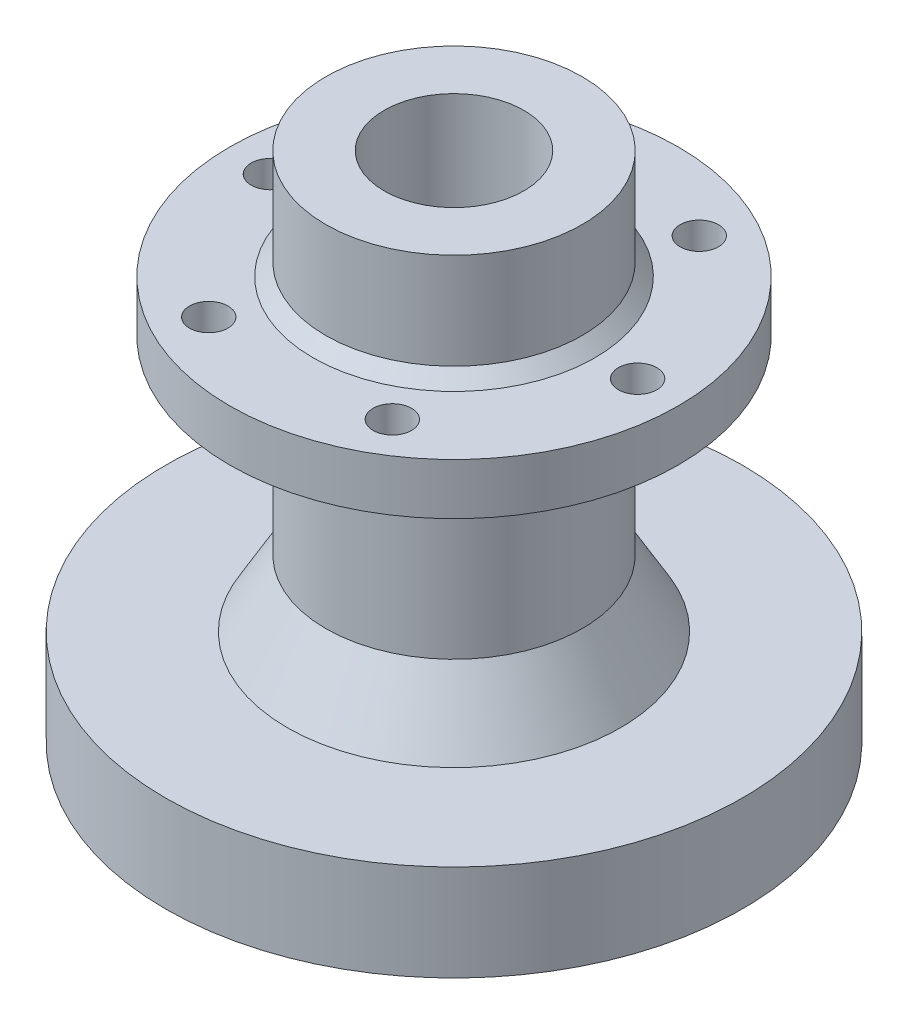
ISO-10303-21;
HEADER;
FILE_DESCRIPTION(('STEP AP214'),'2;1');
FILE_NAME('part.step','',(''),(''),'','','');
FILE_SCHEMA(('AUTOMOTIVE_DESIGN { 1 0 10303 214 1 1 1 1 }'));
ENDSEC;
DATA;
#1=APPLICATION_CONTEXT('core data for automotive mechanical design processes');
#2=APPLICATION_PROTOCOL_DEFINITION('international standard','automotive_design',2000,#1);
#3=PRODUCT_CONTEXT('',#1,'mechanical');
#4=PRODUCT('Part','Part','',(#3));
#5=PRODUCT_RELATED_PRODUCT_CATEGORY('part','',(#4));
#6=PRODUCT_DEFINITION_FORMATION('','',#4);
#7=PRODUCT_DEFINITION_CONTEXT('part definition',#1,'design');
#8=PRODUCT_DEFINITION('design','',#6,#7);
#9=PRODUCT_DEFINITION_SHAPE('','',#8);
#10=(LENGTH_UNIT() NAMED_UNIT(*) SI_UNIT(.MILLI.,.METRE.));
#11=(NAMED_UNIT(*) PLANE_ANGLE_UNIT() SI_UNIT($,.RADIAN.));
#12=(NAMED_UNIT(*) SI_UNIT($,.STERADIAN.) SOLID_ANGLE_UNIT());
#13=UNCERTAINTY_MEASURE_WITH_UNIT(LENGTH_MEASURE(1.E-05),#10,'distance_accuracy_value','');
#14=(GEOMETRIC_REPRESENTATION_CONTEXT(3) GLOBAL_UNCERTAINTY_ASSIGNED_CONTEXT((#13)) GLOBAL_UNIT_ASSIGNED_CONTEXT((#10,
#11,#12)) REPRESENTATION_CONTEXT('',''));
#15=CARTESIAN_POINT('',(0.,0.,0.));
#16=DIRECTION('',(0.,0.,1.));
#17=DIRECTION('',(1.,0.,0.));
#18=AXIS2_PLACEMENT_3D('',#15,#16,#17);
#19=CARTESIAN_POINT('',(0.,15.,0.));
#20=DIRECTION('',(0.,1.,0.));
#21=DIRECTION('',(0.,0.,1.));
#22=AXIS2_PLACEMENT_3D('',#19,#20,#21);
#23=PLANE('',#22);
#24=CARTESIAN_POINT('',(0.,15.,0.));
#25=DIRECTION('',(0.,-1.,0.));
#26=DIRECTION('',(0.,0.,-1.));
#27=AXIS2_PLACEMENT_3D('',#24,#25,#26);
#28=CIRCLE('',#27,7.00000000000001);
#29=CARTESIAN_POINT('',(2.5,15.,6.53834841531102));
#30=VERTEX_POINT('',#29);
#31=CARTESIAN_POINT('',(-2.,15.,6.70820393249938));
#32=VERTEX_POINT('',#31);
#33=EDGE_CURVE('E78',#30,#32,#28,.T.);
#34=ORIENTED_EDGE('',*,*,#33,.F.);
#35=DIRECTION('',(0.,0.,-1.));
#36=VECTOR('',#35,1.);
#37=CARTESIAN_POINT('',(2.5,15.,8.85000000000001));
#38=LINE('',#37,#36);
#39=CARTESIAN_POINT('',(2.5,15.,8.85000000000001));
#40=VERTEX_POINT('',#39);
#41=EDGE_CURVE('E80',#40,#30,#38,.T.);
#42=ORIENTED_EDGE('',*,*,#41,.F.);
#43=DIRECTION('',(1.,0.,0.));
#44=VECTOR('',#43,1.);
#45=CARTESIAN_POINT('',(-2.,15.,8.85000000000001));
#46=LINE('',#45,#44);
#47=CARTESIAN_POINT('',(-2.,15.,8.85000000000001));
#48=VERTEX_POINT('',#47);
#49=EDGE_CURVE('E91',#48,#40,#46,.T.);
#50=ORIENTED_EDGE('',*,*,#49,.F.);
#51=DIRECTION('',(0.,0.,1.));
#52=VECTOR('',#51,1.);
#53=CARTESIAN_POINT('',(-2.,15.,6.70820393249938));
#54=LINE('',#53,#52);
#55=EDGE_CURVE('E82',#32,#48,#54,.T.);
#56=ORIENTED_EDGE('',*,*,#55,.F.);
#57=EDGE_LOOP('',(#34,#42,#50,#56));
#58=FACE_BOUND('',#57,.T.);
#59=ADVANCED_FACE('F32',(#58),#23,.F.);
#60=CARTESIAN_POINT('',(0.,80.,0.));
#61=DIRECTION('',(0.,-1.,0.));
#62=DIRECTION('',(0.,0.,-1.));
#63=AXIS2_PLACEMENT_3D('',#60,#61,#62);
#64=CYLINDRICAL_SURFACE('',#63,20.);
#65=CARTESIAN_POINT('',(0.,65.,0.));
#66=DIRECTION('',(0.,1.,0.));
#67=DIRECTION('',(0.,0.,1.));
#68=AXIS2_PLACEMENT_3D('',#65,#66,#67);
#69=CIRCLE('',#68,20.);
#70=CARTESIAN_POINT('',(0.,65.,20.));
#71=VERTEX_POINT('',#70);
#72=EDGE_CURVE('E150',#71,#71,#69,.T.);
#73=ORIENTED_EDGE('',*,*,#72,.T.);
#74=EDGE_LOOP('',(#73));
#75=FACE_BOUND('',#74,.T.);
#76=CARTESIAN_POINT('',(0.,80.,0.));
#77=DIRECTION('',(0.,1.,0.));
#78=DIRECTION('',(0.,0.,1.));
#79=AXIS2_PLACEMENT_3D('',#76,#77,#78);
#80=CIRCLE('',#79,20.);
#81=CARTESIAN_POINT('',(0.,80.,20.));
#82=VERTEX_POINT('',#81);
#83=EDGE_CURVE('E124',#82,#82,#80,.T.);
#84=ORIENTED_EDGE('',*,*,#83,.F.);
#85=EDGE_LOOP('',(#84));
#86=FACE_BOUND('',#85,.T.);
#87=ADVANCED_FACE('F176',(#75,#86),#64,.T.);
#88=CARTESIAN_POINT('',(0.,80.,0.));
#89=DIRECTION('',(0.,1.,0.));
#90=DIRECTION('',(0.,0.,1.));
#91=AXIS2_PLACEMENT_3D('',#88,#89,#90);
#92=PLANE('',#91);
#93=CARTESIAN_POINT('',(0.,80.,0.));
#94=DIRECTION('',(0.,1.,0.));
#95=DIRECTION('',(0.,0.,1.));
#96=AXIS2_PLACEMENT_3D('',#93,#94,#95);
#97=CIRCLE('',#96,10.9);
#98=CARTESIAN_POINT('',(0.,80.,10.9));
#99=VERTEX_POINT('',#98);
#100=EDGE_CURVE('E117',#99,#99,#97,.T.);
#101=ORIENTED_EDGE('',*,*,#100,.F.);
#102=EDGE_LOOP('',(#101));
#103=FACE_BOUND('',#102,.T.);
#104=ORIENTED_EDGE('',*,*,#83,.T.);
#105=EDGE_LOOP('',(#104));
#106=FACE_BOUND('',#105,.T.);
#107=ADVANCED_FACE('F181',(#103,#106),#92,.T.);
#108=CARTESIAN_POINT('',(0.,28.,0.));
#109=DIRECTION('',(0.,1.,0.));
#110=DIRECTION('',(0.,0.,1.));
#111=AXIS2_PLACEMENT_3D('',#108,#109,#110);
#112=CYLINDRICAL_SURFACE('',#111,10.9);
#113=CARTESIAN_POINT('',(0.,28.,0.));
#114=DIRECTION('',(0.,1.,0.));
#115=DIRECTION('',(0.,0.,1.));
#116=AXIS2_PLACEMENT_3D('',#113,#114,#115);
#117=CIRCLE('',#116,10.9);
#118=CARTESIAN_POINT('',(0.,28.,10.9));
#119=VERTEX_POINT('',#118);
#120=EDGE_CURVE('E121',#119,#119,#117,.T.);
#121=CARTESIAN_POINT('',(0.,80.,10.9));
#122=CARTESIAN_POINT('',(0.,79.4583333333333,10.9));
#123=CARTESIAN_POINT('',(0.,78.9166666666667,10.9));
#124=CARTESIAN_POINT('',(0.,77.8333333333333,10.9));
#125=CARTESIAN_POINT('',(0.,77.2916666666667,10.9));
#126=CARTESIAN_POINT('',(0.,76.2083333333333,10.9));
#127=CARTESIAN_POINT('',(0.,75.6666666666667,10.9));
#128=CARTESIAN_POINT('',(0.,74.5833333333333,10.9));
#129=CARTESIAN_POINT('',(0.,74.0416666666667,10.9));
#130=CARTESIAN_POINT('',(0.,72.9583333333333,10.9));
#131=CARTESIAN_POINT('',(0.,72.4166666666667,10.9));
#132=CARTESIAN_POINT('',(0.,71.3333333333333,10.9));
#133=CARTESIAN_POINT('',(0.,70.7916666666667,10.9));
#134=CARTESIAN_POINT('',(0.,69.7083333333333,10.9));
#135=CARTESIAN_POINT('',(0.,69.1666666666667,10.9));
#136=CARTESIAN_POINT('',(0.,68.0833333333333,10.9));
#137=CARTESIAN_POINT('',(0.,67.5416666666667,10.9));
#138=CARTESIAN_POINT('',(0.,66.4583333333333,10.9));
#139=CARTESIAN_POINT('',(0.,65.9166666666667,10.9));
#140=CARTESIAN_POINT('',(0.,64.8333333333333,10.9));
#141=CARTESIAN_POINT('',(0.,64.2916666666667,10.9));
#142=CARTESIAN_POINT('',(0.,63.2083333333333,10.9));
#143=CARTESIAN_POINT('',(0.,62.6666666666667,10.9));
#144=CARTESIAN_POINT('',(0.,61.5833333333333,10.9));
#145=CARTESIAN_POINT('',(0.,61.0416666666667,10.9));
#146=CARTESIAN_POINT('',(0.,59.9583333333333,10.9));
#147=CARTESIAN_POINT('',(0.,59.4166666666667,10.9));
#148=CARTESIAN_POINT('',(0.,58.3333333333333,10.9));
#149=CARTESIAN_POINT('',(0.,57.7916666666667,10.9));
#150=CARTESIAN_POINT('',(0.,56.7083333333333,10.9));
#151=CARTESIAN_POINT('',(0.,56.1666666666667,10.9));
#152=CARTESIAN_POINT('',(0.,55.0833333333333,10.9));
#153=CARTESIAN_POINT('',(0.,54.5416666666667,10.9));
#154=CARTESIAN_POINT('',(0.,53.4583333333333,10.9));
#155=CARTESIAN_POINT('',(0.,52.9166666666667,10.9));
#156=CARTESIAN_POINT('',(0.,51.8333333333333,10.9));
#157=CARTESIAN_POINT('',(0.,51.2916666666667,10.9));
#158=CARTESIAN_POINT('',(0.,50.2083333333333,10.9));
#159=CARTESIAN_POINT('',(0.,49.6666666666667,10.9));
#160=CARTESIAN_POINT('',(0.,48.5833333333333,10.9));
#161=CARTESIAN_POINT('',(0.,48.0416666666667,10.9));
#162=CARTESIAN_POINT('',(0.,46.9583333333333,10.9));
#163=CARTESIAN_POINT('',(0.,46.4166666666667,10.9));
#164=CARTESIAN_POINT('',(0.,45.3333333333333,10.9));
#165=CARTESIAN_POINT('',(0.,44.7916666666667,10.9));
#166=CARTESIAN_POINT('',(0.,43.7083333333333,10.9));
#167=CARTESIAN_POINT('',(0.,43.1666666666667,10.9));
#168=CARTESIAN_POINT('',(0.,42.0833333333333,10.9));
#169=CARTESIAN_POINT('',(0.,41.5416666666667,10.9));
#170=CARTESIAN_POINT('',(0.,40.4583333333333,10.9));
#171=CARTESIAN_POINT('',(0.,39.9166666666667,10.9));
#172=CARTESIAN_POINT('',(0.,38.8333333333333,10.9));
#173=CARTESIAN_POINT('',(0.,38.2916666666667,10.9));
#174=CARTESIAN_POINT('',(0.,37.2083333333333,10.9));
#175=CARTESIAN_POINT('',(0.,36.6666666666667,10.9));
#176=CARTESIAN_POINT('',(0.,35.5833333333333,10.9));
#177=CARTESIAN_POINT('',(0.,35.0416666666667,10.9));
#178=CARTESIAN_POINT('',(0.,33.9583333333333,10.9));
#179=CARTESIAN_POINT('',(0.,33.4166666666667,10.9));
#180=CARTESIAN_POINT('',(0.,32.3333333333333,10.9));
#181=CARTESIAN_POINT('',(0.,31.7916666666667,10.9));
#182=CARTESIAN_POINT('',(0.,30.7083333333333,10.9));
#183=CARTESIAN_POINT('',(0.,30.1666666666667,10.9));
#184=CARTESIAN_POINT('',(0.,29.0833333333333,10.9));
#185=CARTESIAN_POINT('',(0.,28.5416666666667,10.9));
#186=CARTESIAN_POINT('',(0.,28.,10.9));
#187=B_SPLINE_CURVE_WITH_KNOTS('',3,(#121,#122,#123,#124,#125,#126,#127,#128,#129,#130,#131,
#132,#133,#134,#135,#136,#137,#138,#139,#140,#141,#142,#143,#144,#145,#146,#147,#148,#149,#150,
#151,#152,#153,#154,#155,#156,#157,#158,#159,#160,#161,#162,#163,#164,#165,#166,#167,#168,#169,
#170,#171,#172,#173,#174,#175,#176,#177,#178,#179,#180,#181,#182,#183,#184,#185,#186),
.UNSPECIFIED.,.F.,.F.,(4,2,2,2,2,2,2,2,2,2,2,2,2,2,2,2,2,2,2,2,2,2,2,2,2,2,2,2,2,2,2,2,4),(0.,
1.625,3.25,4.875,6.49999999999999,8.12500000000001,9.74999999999999,11.375,13.,14.625,16.25,
17.875,19.5,21.125,22.75,24.375,26.,27.625,29.25,30.875,32.5,34.125,35.75,37.375,39.,40.625,
42.25,43.875,45.5,47.125,48.75,50.375,52.),.UNSPECIFIED.);
#188=EDGE_CURVE('BSEAM238',#99,#119,#187,.T.);
#189=ORIENTED_EDGE('',*,*,#100,.T.);
#190=ORIENTED_EDGE('',*,*,#120,.F.);
#191=ORIENTED_EDGE('',*,*,#188,.T.);
#192=ORIENTED_EDGE('',*,*,#188,.F.);
#193=EDGE_LOOP('',(#189,#191,#190,#192));
#194=FACE_BOUND('',#193,.T.);
#195=ADVANCED_FACE('F238',(#194),#112,.F.);
#196=CARTESIAN_POINT('',(0.,28.,0.));
#197=DIRECTION('',(0.,1.,0.));
#198=DIRECTION('',(0.,0.,1.));
#199=AXIS2_PLACEMENT_3D('',#196,#197,#198);
#200=PLANE('',#199);
#201=ORIENTED_EDGE('',*,*,#120,.T.);
#202=EDGE_LOOP('',(#201));
#203=FACE_BOUND('',#202,.T.);
#204=ADVANCED_FACE('F236',(#203),#200,.T.);
#205=CARTESIAN_POINT('',(0.,63.,0.));
#206=DIRECTION('',(0.,1.,0.));
#207=DIRECTION('',(0.,0.,1.));
#208=AXIS2_PLACEMENT_3D('',#205,#206,#207);
#209=PLANE('',#208);
#210=CARTESIAN_POINT('',(-13.6441470029597,63.,24.6321726778465));
#211=DIRECTION('',(0.,1.,0.));
#212=DIRECTION('',(0.,0.,1.));
#213=AXIS2_PLACEMENT_3D('',#210,#211,#212);
#214=CIRCLE('',#213,3.);
#215=CARTESIAN_POINT('',(-13.6441470029597,63.,27.6321726778465));
#216=VERTEX_POINT('',#215);
#217=EDGE_CURVE('E399',#216,#216,#214,.T.);
#218=ORIENTED_EDGE('',*,*,#217,.F.);
#219=EDGE_LOOP('',(#218));
#220=FACE_BOUND('',#219,.T.);
#221=CARTESIAN_POINT('',(14.5100137879402,63.,24.1322642564556));
#222=DIRECTION('',(0.,1.,0.));
#223=DIRECTION('',(0.,0.,1.));
#224=AXIS2_PLACEMENT_3D('',#221,#222,#223);
#225=CIRCLE('',#224,3.);
#226=CARTESIAN_POINT('',(14.5100137879402,63.,27.1322642564556));
#227=VERTEX_POINT('',#226);
#228=EDGE_CURVE('E403',#227,#227,#225,.T.);
#229=ORIENTED_EDGE('',*,*,#228,.F.);
#230=EDGE_LOOP('',(#229));
#231=FACE_BOUND('',#230,.T.);
#232=CARTESIAN_POINT('',(28.1541607908998,63.,-0.499908421390969));
#233=DIRECTION('',(0.,1.,0.));
#234=DIRECTION('',(0.,0.,1.));
#235=AXIS2_PLACEMENT_3D('',#232,#233,#234);
#236=CIRCLE('',#235,3.);
#237=CARTESIAN_POINT('',(28.1541607908998,63.,2.50009157860903));
#238=VERTEX_POINT('',#237);
#239=EDGE_CURVE('E411',#238,#238,#236,.T.);
#240=ORIENTED_EDGE('',*,*,#239,.F.);
#241=EDGE_LOOP('',(#240));
#242=FACE_BOUND('',#241,.T.);
#243=CARTESIAN_POINT('',(13.6441470029595,63.,-24.6321726778466));
#244=DIRECTION('',(0.,1.,0.));
#245=DIRECTION('',(0.,0.,1.));
#246=AXIS2_PLACEMENT_3D('',#243,#244,#245);
#247=CIRCLE('',#246,3.00000000000001);
#248=CARTESIAN_POINT('',(13.6441470029595,63.,-21.6321726778466));
#249=VERTEX_POINT('',#248);
#250=EDGE_CURVE('E416',#249,#249,#247,.T.);
#251=ORIENTED_EDGE('',*,*,#250,.F.);
#252=EDGE_LOOP('',(#251));
#253=FACE_BOUND('',#252,.T.);
#254=CARTESIAN_POINT('',(-14.5100137879404,63.,-24.1322642564555));
#255=DIRECTION('',(0.,1.,0.));
#256=DIRECTION('',(0.,0.,1.));
#257=AXIS2_PLACEMENT_3D('',#254,#255,#256);
#258=CIRCLE('',#257,3.);
#259=CARTESIAN_POINT('',(-14.5100137879404,63.,-21.1322642564555));
#260=VERTEX_POINT('',#259);
#261=EDGE_CURVE('E422',#260,#260,#258,.T.);
#262=ORIENTED_EDGE('',*,*,#261,.F.);
#263=EDGE_LOOP('',(#262));
#264=FACE_BOUND('',#263,.T.);
#265=CARTESIAN_POINT('',(-28.1541607908998,63.,0.499908421391165));
#266=DIRECTION('',(0.,1.,0.));
#267=DIRECTION('',(0.,0.,1.));
#268=AXIS2_PLACEMENT_3D('',#265,#266,#267);
#269=CIRCLE('',#268,3.);
#270=CARTESIAN_POINT('',(-28.1541607908998,63.,3.49990842139117));
#271=VERTEX_POINT('',#270);
#272=EDGE_CURVE('E428',#271,#271,#269,.T.);
#273=ORIENTED_EDGE('',*,*,#272,.F.);
#274=EDGE_LOOP('',(#273));
#275=FACE_BOUND('',#274,.T.);
#276=CARTESIAN_POINT('',(0.,63.,0.));
#277=DIRECTION('',(0.,1.,0.));
#278=DIRECTION('',(0.,0.,1.));
#279=AXIS2_PLACEMENT_3D('',#276,#277,#278);
#280=CIRCLE('',#279,22.);
#281=CARTESIAN_POINT('',(0.,63.,22.));
#282=VERTEX_POINT('',#281);
#283=EDGE_CURVE('E153',#282,#282,#280,.F.);
#284=ORIENTED_EDGE('',*,*,#283,.T.);
#285=EDGE_LOOP('',(#284));
#286=FACE_BOUND('',#285,.T.);
#287=CARTESIAN_POINT('',(0.,63.,0.));
#288=DIRECTION('',(0.,1.,0.));
#289=DIRECTION('',(0.,0.,1.));
#290=AXIS2_PLACEMENT_3D('',#287,#288,#289);
#291=CIRCLE('',#290,35.);
#292=CARTESIAN_POINT('',(0.,63.,35.));
#293=VERTEX_POINT('',#292);
#294=EDGE_CURVE('E114',#293,#293,#291,.T.);
#295=ORIENTED_EDGE('',*,*,#294,.T.);
#296=EDGE_LOOP('',(#295));
#297=FACE_BOUND('',#296,.T.);
#298=ADVANCED_FACE('F223',(#220,#231,#242,#253,#264,#275,#286,#297),#209,.T.);
#299=CARTESIAN_POINT('',(0.,55.,0.));
#300=DIRECTION('',(0.,1.,0.));
#301=DIRECTION('',(0.,0.,1.));
#302=AXIS2_PLACEMENT_3D('',#299,#300,#301);
#303=PLANE('',#302);
#304=CARTESIAN_POINT('',(-13.6441470029597,55.,24.6321726778465));
#305=DIRECTION('',(0.,1.,0.));
#306=DIRECTION('',(0.,0.,1.));
#307=AXIS2_PLACEMENT_3D('',#304,#305,#306);
#308=CIRCLE('',#307,3.);
#309=CARTESIAN_POINT('',(-13.6441470029597,55.,27.6321726778465));
#310=VERTEX_POINT('',#309);
#311=EDGE_CURVE('E402',#310,#310,#308,.F.);
#312=ORIENTED_EDGE('',*,*,#311,.F.);
#313=EDGE_LOOP('',(#312));
#314=FACE_BOUND('',#313,.T.);
#315=CARTESIAN_POINT('',(14.5100137879402,55.,24.1322642564556));
#316=DIRECTION('',(0.,1.,0.));
#317=DIRECTION('',(0.,0.,1.));
#318=AXIS2_PLACEMENT_3D('',#315,#316,#317);
#319=CIRCLE('',#318,3.);
#320=CARTESIAN_POINT('',(14.5100137879402,55.,27.1322642564556));
#321=VERTEX_POINT('',#320);
#322=EDGE_CURVE('E406',#321,#321,#319,.F.);
#323=ORIENTED_EDGE('',*,*,#322,.F.);
#324=EDGE_LOOP('',(#323));
#325=FACE_BOUND('',#324,.T.);
#326=CARTESIAN_POINT('',(28.1541607908998,55.,-0.499908421390969));
#327=DIRECTION('',(0.,1.,0.));
#328=DIRECTION('',(0.,0.,1.));
#329=AXIS2_PLACEMENT_3D('',#326,#327,#328);
#330=CIRCLE('',#329,3.);
#331=CARTESIAN_POINT('',(28.1541607908998,55.,2.50009157860903));
#332=VERTEX_POINT('',#331);
#333=EDGE_CURVE('E413',#332,#332,#330,.F.);
#334=ORIENTED_EDGE('',*,*,#333,.F.);
#335=EDGE_LOOP('',(#334));
#336=FACE_BOUND('',#335,.T.);
#337=CARTESIAN_POINT('',(13.6441470029595,55.,-24.6321726778466));
#338=DIRECTION('',(0.,1.,0.));
#339=DIRECTION('',(0.,0.,1.));
#340=AXIS2_PLACEMENT_3D('',#337,#338,#339);
#341=CIRCLE('',#340,3.00000000000001);
#342=CARTESIAN_POINT('',(13.6441470029595,55.,-21.6321726778466));
#343=VERTEX_POINT('',#342);
#344=EDGE_CURVE('E419',#343,#343,#341,.F.);
#345=ORIENTED_EDGE('',*,*,#344,.F.);
#346=EDGE_LOOP('',(#345));
#347=FACE_BOUND('',#346,.T.);
#348=CARTESIAN_POINT('',(-14.5100137879404,55.,-24.1322642564555));
#349=DIRECTION('',(0.,1.,0.));
#350=DIRECTION('',(0.,0.,1.));
#351=AXIS2_PLACEMENT_3D('',#348,#349,#350);
#352=CIRCLE('',#351,3.);
#353=CARTESIAN_POINT('',(-14.5100137879404,55.,-21.1322642564555));
#354=VERTEX_POINT('',#353);
#355=EDGE_CURVE('E425',#354,#354,#352,.F.);
#356=ORIENTED_EDGE('',*,*,#355,.F.);
#357=EDGE_LOOP('',(#356));
#358=FACE_BOUND('',#357,.T.);
#359=CARTESIAN_POINT('',(-28.1541607908998,55.,0.499908421391165));
#360=DIRECTION('',(0.,1.,0.));
#361=DIRECTION('',(0.,0.,1.));
#362=AXIS2_PLACEMENT_3D('',#359,#360,#361);
#363=CIRCLE('',#362,3.);
#364=CARTESIAN_POINT('',(-28.1541607908998,55.,3.49990842139117));
#365=VERTEX_POINT('',#364);
#366=EDGE_CURVE('E85',#365,#365,#363,.F.);
#367=ORIENTED_EDGE('',*,*,#366,.F.);
#368=EDGE_LOOP('',(#367));
#369=FACE_BOUND('',#368,.T.);
#370=CARTESIAN_POINT('',(0.,55.,0.));
#371=DIRECTION('',(0.,1.,0.));
#372=DIRECTION('',(0.,0.,1.));
#373=AXIS2_PLACEMENT_3D('',#370,#371,#372);
#374=CIRCLE('',#373,22.);
#375=CARTESIAN_POINT('',(0.,55.,22.));
#376=VERTEX_POINT('',#375);
#377=EDGE_CURVE('E142',#376,#376,#374,.T.);
#378=ORIENTED_EDGE('',*,*,#377,.T.);
#379=EDGE_LOOP('',(#378));
#380=FACE_BOUND('',#379,.T.);
#381=CARTESIAN_POINT('',(0.,55.,0.));
#382=DIRECTION('',(0.,1.,0.));
#383=DIRECTION('',(0.,0.,1.));
#384=AXIS2_PLACEMENT_3D('',#381,#382,#383);
#385=CIRCLE('',#384,35.);
#386=CARTESIAN_POINT('',(0.,55.,35.));
#387=VERTEX_POINT('',#386);
#388=EDGE_CURVE('E118',#387,#387,#385,.T.);
#389=ORIENTED_EDGE('',*,*,#388,.F.);
#390=EDGE_LOOP('',(#389));
#391=FACE_BOUND('',#390,.T.);
#392=ADVANCED_FACE('F220',(#314,#325,#336,#347,#358,#369,#380,#391),#303,.F.);
#393=CARTESIAN_POINT('',(0.,63.,0.));
#394=DIRECTION('',(0.,-1.,0.));
#395=DIRECTION('',(0.,0.,-1.));
#396=AXIS2_PLACEMENT_3D('',#393,#394,#395);
#397=CYLINDRICAL_SURFACE('',#396,35.);
#398=ORIENTED_EDGE('',*,*,#294,.F.);
#399=EDGE_LOOP('',(#398));
#400=FACE_BOUND('',#399,.T.);
#401=ORIENTED_EDGE('',*,*,#388,.T.);
#402=EDGE_LOOP('',(#401));
#403=FACE_BOUND('',#402,.T.);
#404=ADVANCED_FACE('F190',(#400,#403),#397,.T.);
#405=CARTESIAN_POINT('',(2.5,15.,8.85000000000001));
#406=DIRECTION('',(-1.,0.,0.));
#407=DIRECTION('',(0.,0.,1.));
#408=AXIS2_PLACEMENT_3D('',#405,#406,#407);
#409=PLANE('',#408);
#410=DIRECTION('',(0.,0.,-1.));
#411=VECTOR('',#410,1.);
#412=CARTESIAN_POINT('',(2.5,0.,8.85000000000001));
#413=LINE('',#412,#411);
#414=CARTESIAN_POINT('',(2.5,0.,8.85000000000001));
#415=VERTEX_POINT('',#414);
#416=CARTESIAN_POINT('',(2.5,0.,6.53834841531102));
#417=VERTEX_POINT('',#416);
#418=EDGE_CURVE('E108',#415,#417,#413,.T.);
#419=ORIENTED_EDGE('',*,*,#418,.F.);
#420=DIRECTION('',(0.,-1.,0.));
#421=VECTOR('',#420,1.);
#422=CARTESIAN_POINT('',(2.5,15.,8.85000000000001));
#423=LINE('',#422,#421);
#424=EDGE_CURVE('E57',#40,#415,#423,.T.);
#425=ORIENTED_EDGE('',*,*,#424,.F.);
#426=ORIENTED_EDGE('',*,*,#41,.T.);
#427=DIRECTION('',(0.,-1.,0.));
#428=VECTOR('',#427,1.);
#429=CARTESIAN_POINT('',(2.5,15.,6.53834841531102));
#430=LINE('',#429,#428);
#431=EDGE_CURVE('E89',#30,#417,#430,.T.);
#432=ORIENTED_EDGE('',*,*,#431,.T.);
#433=EDGE_LOOP('',(#419,#425,#426,#432));
#434=FACE_BOUND('',#433,.T.);
#435=ADVANCED_FACE('F88',(#434),#409,.T.);
#436=CARTESIAN_POINT('',(-2.,15.,8.85000000000001));
#437=DIRECTION('',(0.,0.,-1.));
#438=DIRECTION('',(-1.,0.,0.));
#439=AXIS2_PLACEMENT_3D('',#436,#437,#438);
#440=PLANE('',#439);
#441=DIRECTION('',(1.,0.,0.));
#442=VECTOR('',#441,1.);
#443=CARTESIAN_POINT('',(-2.,0.,8.85000000000001));
#444=LINE('',#443,#442);
#445=CARTESIAN_POINT('',(-2.,0.,8.85000000000001));
#446=VERTEX_POINT('',#445);
#447=EDGE_CURVE('E134',#446,#415,#444,.T.);
#448=ORIENTED_EDGE('',*,*,#447,.F.);
#449=DIRECTION('',(0.,-1.,0.));
#450=VECTOR('',#449,1.);
#451=CARTESIAN_POINT('',(-2.,15.,8.85000000000001));
#452=LINE('',#451,#450);
#453=EDGE_CURVE('E95',#48,#446,#452,.T.);
#454=ORIENTED_EDGE('',*,*,#453,.F.);
#455=ORIENTED_EDGE('',*,*,#49,.T.);
#456=ORIENTED_EDGE('',*,*,#424,.T.);
#457=EDGE_LOOP('',(#448,#454,#455,#456));
#458=FACE_BOUND('',#457,.T.);
#459=ADVANCED_FACE('F189',(#458),#440,.T.);
#460=CARTESIAN_POINT('',(-2.,15.,6.70820393249938));
#461=DIRECTION('',(1.,0.,0.));
#462=DIRECTION('',(0.,0.,-1.));
#463=AXIS2_PLACEMENT_3D('',#460,#461,#462);
#464=PLANE('',#463);
#465=DIRECTION('',(0.,0.,1.));
#466=VECTOR('',#465,1.);
#467=CARTESIAN_POINT('',(-2.,0.,6.70820393249938));
#468=LINE('',#467,#466);
#469=CARTESIAN_POINT('',(-2.,0.,6.70820393249938));
#470=VERTEX_POINT('',#469);
#471=EDGE_CURVE('E131',#470,#446,#468,.T.);
#472=ORIENTED_EDGE('',*,*,#471,.F.);
#473=DIRECTION('',(0.,-1.,0.));
#474=VECTOR('',#473,1.);
#475=CARTESIAN_POINT('',(-2.,15.,6.70820393249938));
#476=LINE('',#475,#474);
#477=EDGE_CURVE('E102',#32,#470,#476,.T.);
#478=ORIENTED_EDGE('',*,*,#477,.F.);
#479=ORIENTED_EDGE('',*,*,#55,.T.);
#480=ORIENTED_EDGE('',*,*,#453,.T.);
#481=EDGE_LOOP('',(#472,#478,#479,#480));
#482=FACE_BOUND('',#481,.T.);
#483=ADVANCED_FACE('F193',(#482),#464,.T.);
#484=CARTESIAN_POINT('',(0.,15.,0.));
#485=DIRECTION('',(0.,-1.,0.));
#486=DIRECTION('',(0.,0.,-1.));
#487=AXIS2_PLACEMENT_3D('',#484,#485,#486);
#488=CYLINDRICAL_SURFACE('',#487,7.00000000000001);
#489=CARTESIAN_POINT('',(0.,0.,0.));
#490=DIRECTION('',(0.,1.,0.));
#491=DIRECTION('',(0.,0.,1.));
#492=AXIS2_PLACEMENT_3D('',#489,#490,#491);
#493=CIRCLE('',#492,7.00000000000001);
#494=EDGE_CURVE('E49',#417,#470,#493,.T.);
#495=ORIENTED_EDGE('',*,*,#494,.F.);
#496=ORIENTED_EDGE('',*,*,#431,.F.);
#497=ORIENTED_EDGE('',*,*,#33,.T.);
#498=ORIENTED_EDGE('',*,*,#477,.T.);
#499=EDGE_LOOP('',(#495,#496,#497,#498));
#500=FACE_BOUND('',#499,.T.);
#501=CARTESIAN_POINT('',(0.,19.,0.));
#502=DIRECTION('',(0.,-1.,0.));
#503=DIRECTION('',(0.,0.,-1.));
#504=AXIS2_PLACEMENT_3D('',#501,#502,#503);
#505=CIRCLE('',#504,7.00000000000001);
#506=CARTESIAN_POINT('',(0.,19.,-7.00000000000001));
#507=VERTEX_POINT('',#506);
#508=EDGE_CURVE('E84',#507,#507,#505,.T.);
#509=ORIENTED_EDGE('',*,*,#508,.F.);
#510=EDGE_LOOP('',(#509));
#511=FACE_BOUND('',#510,.T.);
#512=ADVANCED_FACE('F93',(#500,#511),#488,.F.);
#513=CARTESIAN_POINT('',(0.,0.,0.));
#514=DIRECTION('',(0.,1.,0.));
#515=DIRECTION('',(0.,0.,1.));
#516=AXIS2_PLACEMENT_3D('',#513,#514,#515);
#517=PLANE('',#516);
#518=CARTESIAN_POINT('',(0.,0.,0.));
#519=DIRECTION('',(0.,1.,0.));
#520=DIRECTION('',(0.,0.,1.));
#521=AXIS2_PLACEMENT_3D('',#518,#519,#520);
#522=CIRCLE('',#521,45.);
#523=CARTESIAN_POINT('',(0.,0.,45.));
#524=VERTEX_POINT('',#523);
#525=EDGE_CURVE('E104',#524,#524,#522,.T.);
#526=ORIENTED_EDGE('',*,*,#525,.F.);
#527=EDGE_LOOP('',(#526));
#528=FACE_BOUND('',#527,.T.);
#529=ORIENTED_EDGE('',*,*,#494,.T.);
#530=ORIENTED_EDGE('',*,*,#471,.T.);
#531=ORIENTED_EDGE('',*,*,#447,.T.);
#532=ORIENTED_EDGE('',*,*,#418,.T.);
#533=EDGE_LOOP('',(#529,#530,#531,#532));
#534=FACE_BOUND('',#533,.T.);
#535=ADVANCED_FACE('F199',(#528,#534),#517,.F.);
#536=CARTESIAN_POINT('',(0.,15.,0.));
#537=DIRECTION('',(0.,-1.,0.));
#538=DIRECTION('',(0.,0.,-1.));
#539=AXIS2_PLACEMENT_3D('',#536,#537,#538);
#540=CYLINDRICAL_SURFACE('',#539,45.);
#541=CARTESIAN_POINT('',(0.,15.,0.));
#542=DIRECTION('',(0.,1.,0.));
#543=DIRECTION('',(0.,0.,1.));
#544=AXIS2_PLACEMENT_3D('',#541,#542,#543);
#545=CIRCLE('',#544,45.);
#546=CARTESIAN_POINT('',(0.,15.,45.));
#547=VERTEX_POINT('',#546);
#548=EDGE_CURVE('E139',#547,#547,#545,.T.);
#549=ORIENTED_EDGE('',*,*,#548,.F.);
#550=EDGE_LOOP('',(#549));
#551=FACE_BOUND('',#550,.T.);
#552=ORIENTED_EDGE('',*,*,#525,.T.);
#553=EDGE_LOOP('',(#552));
#554=FACE_BOUND('',#553,.T.);
#555=ADVANCED_FACE('F203',(#551,#554),#540,.T.);
#556=CARTESIAN_POINT('',(0.,15.,0.));
#557=DIRECTION('',(0.,1.,0.));
#558=DIRECTION('',(0.,0.,1.));
#559=AXIS2_PLACEMENT_3D('',#556,#557,#558);
#560=PLANE('',#559);
#561=CARTESIAN_POINT('',(0.,15.,0.));
#562=DIRECTION('',(0.,1.,0.));
#563=DIRECTION('',(0.,0.,1.));
#564=AXIS2_PLACEMENT_3D('',#561,#562,#563);
#565=CIRCLE('',#564,26.);
#566=CARTESIAN_POINT('',(0.,15.,26.));
#567=VERTEX_POINT('',#566);
#568=EDGE_CURVE('E11',#567,#567,#565,.F.);
#569=ORIENTED_EDGE('',*,*,#568,.T.);
#570=EDGE_LOOP('',(#569));
#571=FACE_BOUND('',#570,.T.);
#572=ORIENTED_EDGE('',*,*,#548,.T.);
#573=EDGE_LOOP('',(#572));
#574=FACE_BOUND('',#573,.T.);
#575=ADVANCED_FACE('F200',(#571,#574),#560,.T.);
#576=CARTESIAN_POINT('',(0.,25.3923048454134,0.));
#577=DIRECTION('',(0.,1.,0.));
#578=DIRECTION('',(0.,0.,1.));
#579=AXIS2_PLACEMENT_3D('',#576,#577,#578);
#580=CIRCLE('',#579,20.);
#581=CARTESIAN_POINT('',(0.,25.3923048454134,20.));
#582=VERTEX_POINT('',#581);
#583=EDGE_CURVE('E41',#582,#582,#580,.T.);
#584=ORIENTED_EDGE('',*,*,#583,.T.);
#585=EDGE_LOOP('',(#584));
#586=FACE_BOUND('',#585,.T.);
#587=CARTESIAN_POINT('',(0.,53.,0.));
#588=DIRECTION('',(0.,1.,0.));
#589=DIRECTION('',(0.,0.,1.));
#590=AXIS2_PLACEMENT_3D('',#587,#588,#589);
#591=CIRCLE('',#590,20.);
#592=CARTESIAN_POINT('',(0.,53.,20.));
#593=VERTEX_POINT('',#592);
#594=EDGE_CURVE('E147',#593,#593,#591,.F.);
#595=ORIENTED_EDGE('',*,*,#594,.T.);
#596=EDGE_LOOP('',(#595));
#597=FACE_BOUND('',#596,.T.);
#598=ADVANCED_FACE('F158',(#586,#597),#64,.T.);
#599=CARTESIAN_POINT('',(0.,55.,0.));
#600=DIRECTION('',(0.,1.,0.));
#601=DIRECTION('',(0.,0.,1.));
#602=AXIS2_PLACEMENT_3D('',#599,#600,#601);
#603=CONICAL_SURFACE('',#602,22.,0.785398163397451);
#604=ORIENTED_EDGE('',*,*,#594,.F.);
#605=EDGE_LOOP('',(#604));
#606=FACE_BOUND('',#605,.T.);
#607=ORIENTED_EDGE('',*,*,#377,.F.);
#608=EDGE_LOOP('',(#607));
#609=FACE_BOUND('',#608,.T.);
#610=ADVANCED_FACE('F172',(#606,#609),#603,.T.);
#611=CARTESIAN_POINT('',(0.,65.,0.));
#612=DIRECTION('',(0.,-1.,0.));
#613=DIRECTION('',(0.,0.,-1.));
#614=AXIS2_PLACEMENT_3D('',#611,#612,#613);
#615=CONICAL_SURFACE('',#614,20.,0.785398163397446);
#616=ORIENTED_EDGE('',*,*,#283,.F.);
#617=EDGE_LOOP('',(#616));
#618=FACE_BOUND('',#617,.T.);
#619=ORIENTED_EDGE('',*,*,#72,.F.);
#620=EDGE_LOOP('',(#619));
#621=FACE_BOUND('',#620,.T.);
#622=ADVANCED_FACE('F163',(#618,#621),#615,.T.);
#623=CARTESIAN_POINT('',(0.,25.3923048454134,0.));
#624=DIRECTION('',(0.,-1.,0.));
#625=DIRECTION('',(0.,0.,-1.));
#626=AXIS2_PLACEMENT_3D('',#623,#624,#625);
#627=CONICAL_SURFACE('',#626,20.,0.523598775598293);
#628=ORIENTED_EDGE('',*,*,#568,.F.);
#629=EDGE_LOOP('',(#628));
#630=FACE_BOUND('',#629,.T.);
#631=ORIENTED_EDGE('',*,*,#583,.F.);
#632=EDGE_LOOP('',(#631));
#633=FACE_BOUND('',#632,.T.);
#634=ADVANCED_FACE('F34',(#630,#633),#627,.T.);
#635=CARTESIAN_POINT('',(0.,19.,0.));
#636=DIRECTION('',(0.,-1.,0.));
#637=DIRECTION('',(0.,0.,-1.));
#638=AXIS2_PLACEMENT_3D('',#635,#636,#637);
#639=PLANE('',#638);
#640=ORIENTED_EDGE('',*,*,#508,.T.);
#641=EDGE_LOOP('',(#640));
#642=FACE_BOUND('',#641,.T.);
#643=ADVANCED_FACE('F162',(#642),#639,.T.);
#644=CARTESIAN_POINT('',(-28.1541607908998,-0.00102500000000172,0.499908421391165));
#645=DIRECTION('',(0.,1.,0.));
#646=DIRECTION('',(0.,0.,1.));
#647=AXIS2_PLACEMENT_3D('',#644,#645,#646);
#648=CYLINDRICAL_SURFACE('',#647,3.);
#649=ORIENTED_EDGE('',*,*,#272,.T.);
#650=EDGE_LOOP('',(#649));
#651=FACE_BOUND('',#650,.T.);
#652=ORIENTED_EDGE('',*,*,#366,.T.);
#653=EDGE_LOOP('',(#652));
#654=FACE_BOUND('',#653,.T.);
#655=ADVANCED_FACE('F169',(#651,#654),#648,.F.);
#656=CARTESIAN_POINT('',(-14.5100137879404,-0.00102500000000172,-24.1322642564555));
#657=DIRECTION('',(0.,1.,0.));
#658=DIRECTION('',(0.,0.,1.));
#659=AXIS2_PLACEMENT_3D('',#656,#657,#658);
#660=CYLINDRICAL_SURFACE('',#659,3.);
#661=ORIENTED_EDGE('',*,*,#261,.T.);
#662=EDGE_LOOP('',(#661));
#663=FACE_BOUND('',#662,.T.);
#664=ORIENTED_EDGE('',*,*,#355,.T.);
#665=EDGE_LOOP('',(#664));
#666=FACE_BOUND('',#665,.T.);
#667=ADVANCED_FACE('F342',(#663,#666),#660,.F.);
#668=CARTESIAN_POINT('',(13.6441470029595,-0.00102500000000172,-24.6321726778466));
#669=DIRECTION('',(0.,1.,0.));
#670=DIRECTION('',(0.,0.,1.));
#671=AXIS2_PLACEMENT_3D('',#668,#669,#670);
#672=CYLINDRICAL_SURFACE('',#671,3.00000000000001);
#673=ORIENTED_EDGE('',*,*,#250,.T.);
#674=EDGE_LOOP('',(#673));
#675=FACE_BOUND('',#674,.T.);
#676=ORIENTED_EDGE('',*,*,#344,.T.);
#677=EDGE_LOOP('',(#676));
#678=FACE_BOUND('',#677,.T.);
#679=ADVANCED_FACE('F352',(#675,#678),#672,.F.);
#680=CARTESIAN_POINT('',(28.1541607908998,-0.00102500000000172,-0.499908421390969));
#681=DIRECTION('',(0.,1.,0.));
#682=DIRECTION('',(0.,0.,1.));
#683=AXIS2_PLACEMENT_3D('',#680,#681,#682);
#684=CYLINDRICAL_SURFACE('',#683,3.);
#685=ORIENTED_EDGE('',*,*,#239,.T.);
#686=EDGE_LOOP('',(#685));
#687=FACE_BOUND('',#686,.T.);
#688=ORIENTED_EDGE('',*,*,#333,.T.);
#689=EDGE_LOOP('',(#688));
#690=FACE_BOUND('',#689,.T.);
#691=ADVANCED_FACE('F362',(#687,#690),#684,.F.);
#692=CARTESIAN_POINT('',(14.5100137879402,-0.00102500000000172,24.1322642564556));
#693=DIRECTION('',(0.,1.,0.));
#694=DIRECTION('',(0.,0.,1.));
#695=AXIS2_PLACEMENT_3D('',#692,#693,#694);
#696=CYLINDRICAL_SURFACE('',#695,3.);
#697=ORIENTED_EDGE('',*,*,#228,.T.);
#698=EDGE_LOOP('',(#697));
#699=FACE_BOUND('',#698,.T.);
#700=ORIENTED_EDGE('',*,*,#322,.T.);
#701=EDGE_LOOP('',(#700));
#702=FACE_BOUND('',#701,.T.);
#703=ADVANCED_FACE('F372',(#699,#702),#696,.F.);
#704=CARTESIAN_POINT('',(-13.6441470029597,-0.00102500000000172,24.6321726778465));
#705=DIRECTION('',(0.,1.,0.));
#706=DIRECTION('',(0.,0.,1.));
#707=AXIS2_PLACEMENT_3D('',#704,#705,#706);
#708=CYLINDRICAL_SURFACE('',#707,3.);
#709=ORIENTED_EDGE('',*,*,#217,.T.);
#710=EDGE_LOOP('',(#709));
#711=FACE_BOUND('',#710,.T.);
#712=ORIENTED_EDGE('',*,*,#311,.T.);
#713=EDGE_LOOP('',(#712));
#714=FACE_BOUND('',#713,.T.);
#715=ADVANCED_FACE('F382',(#711,#714),#708,.F.);
#716=CLOSED_SHELL('',(#59,#87,#107,#195,#204,#298,#392,#404,#435,#459,#483,#512,#535,#555,#575,
#598,#610,#622,#634,#643,#655,#667,#679,#691,#703,#715));
#717=MANIFOLD_SOLID_BREP('B2',#716);
#718=ADVANCED_BREP_SHAPE_REPRESENTATION('',(#18,#717),#14);
#719=SHAPE_DEFINITION_REPRESENTATION(#9,#718);
ENDSEC;
END-ISO-10303-21;
